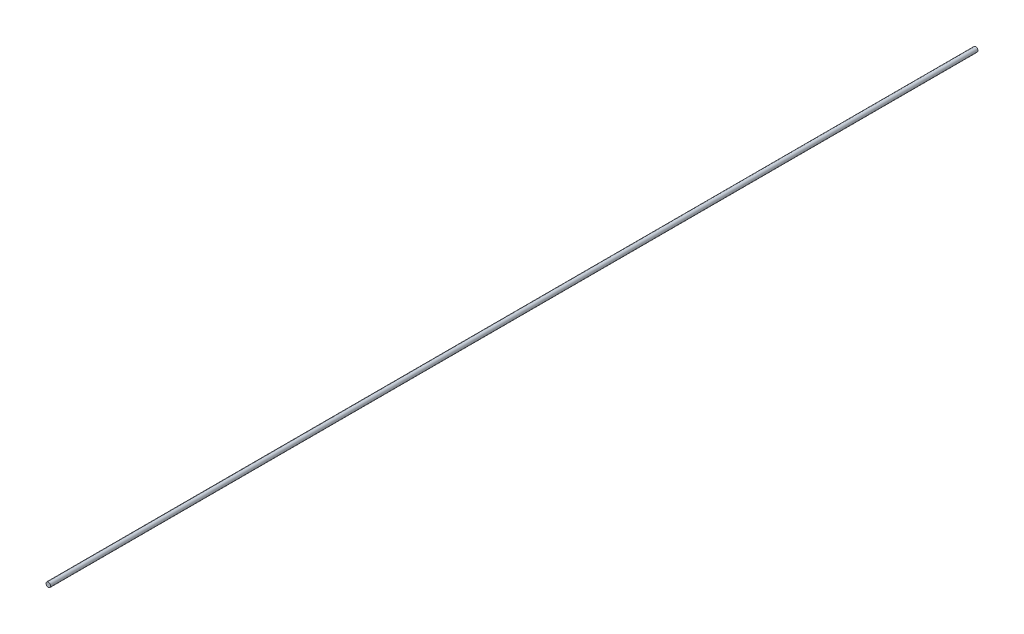
ISO-10303-21;
HEADER;
FILE_DESCRIPTION(('STEP AP214'),'2;1');
FILE_NAME('part.step','',(''),(''),'','','');
FILE_SCHEMA(('AUTOMOTIVE_DESIGN { 1 0 10303 214 1 1 1 1 }'));
ENDSEC;
DATA;
#1=APPLICATION_CONTEXT('core data for automotive mechanical design processes');
#2=APPLICATION_PROTOCOL_DEFINITION('international standard','automotive_design',2000,#1);
#3=PRODUCT_CONTEXT('',#1,'mechanical');
#4=PRODUCT('Part','Part','',(#3));
#5=PRODUCT_RELATED_PRODUCT_CATEGORY('part','',(#4));
#6=PRODUCT_DEFINITION_FORMATION('','',#4);
#7=PRODUCT_DEFINITION_CONTEXT('part definition',#1,'design');
#8=PRODUCT_DEFINITION('design','',#6,#7);
#9=PRODUCT_DEFINITION_SHAPE('','',#8);
#10=(LENGTH_UNIT() NAMED_UNIT(*) SI_UNIT(.MILLI.,.METRE.));
#11=(NAMED_UNIT(*) PLANE_ANGLE_UNIT() SI_UNIT($,.RADIAN.));
#12=(NAMED_UNIT(*) SI_UNIT($,.STERADIAN.) SOLID_ANGLE_UNIT());
#13=UNCERTAINTY_MEASURE_WITH_UNIT(LENGTH_MEASURE(1.E-05),#10,'distance_accuracy_value','');
#14=(GEOMETRIC_REPRESENTATION_CONTEXT(3) GLOBAL_UNCERTAINTY_ASSIGNED_CONTEXT((#13)) GLOBAL_UNIT_ASSIGNED_CONTEXT((#10,
#11,#12)) REPRESENTATION_CONTEXT('',''));
#15=CARTESIAN_POINT('',(0.,0.,0.));
#16=DIRECTION('',(0.,0.,1.));
#17=DIRECTION('',(1.,0.,0.));
#18=AXIS2_PLACEMENT_3D('',#15,#16,#17);
#19=CARTESIAN_POINT('',(0.,0.,200.));
#20=DIRECTION('',(0.,0.,-1.));
#21=DIRECTION('',(-1.,0.,0.));
#22=AXIS2_PLACEMENT_3D('',#19,#20,#21);
#23=CYLINDRICAL_SURFACE('',#22,0.5);
#24=CARTESIAN_POINT('',(0.,0.,200.));
#25=DIRECTION('',(0.,0.,1.));
#26=DIRECTION('',(1.,0.,0.));
#27=AXIS2_PLACEMENT_3D('',#24,#25,#26);
#28=CIRCLE('',#27,0.5);
#29=CARTESIAN_POINT('',(0.5,0.,200.));
#30=VERTEX_POINT('',#29);
#31=EDGE_CURVE('E10',#30,#30,#28,.T.);
#32=ORIENTED_EDGE('',*,*,#31,.F.);
#33=EDGE_LOOP('',(#32));
#34=FACE_BOUND('',#33,.T.);
#35=CARTESIAN_POINT('',(0.,0.,0.));
#36=DIRECTION('',(0.,0.,1.));
#37=DIRECTION('',(1.,0.,0.));
#38=AXIS2_PLACEMENT_3D('',#35,#36,#37);
#39=CIRCLE('',#38,0.5);
#40=CARTESIAN_POINT('',(0.5,0.,0.));
#41=VERTEX_POINT('',#40);
#42=EDGE_CURVE('E34',#41,#41,#39,.T.);
#43=ORIENTED_EDGE('',*,*,#42,.T.);
#44=EDGE_LOOP('',(#43));
#45=FACE_BOUND('',#44,.T.);
#46=ADVANCED_FACE('F31',(#34,#45),#23,.T.);
#47=CARTESIAN_POINT('',(0.,0.,200.));
#48=DIRECTION('',(0.,0.,1.));
#49=DIRECTION('',(1.,0.,0.));
#50=AXIS2_PLACEMENT_3D('',#47,#48,#49);
#51=PLANE('',#50);
#52=ORIENTED_EDGE('',*,*,#31,.T.);
#53=EDGE_LOOP('',(#52));
#54=FACE_BOUND('',#53,.T.);
#55=ADVANCED_FACE('F46',(#54),#51,.T.);
#56=CARTESIAN_POINT('',(0.,0.,0.));
#57=DIRECTION('',(0.,0.,1.));
#58=DIRECTION('',(1.,0.,0.));
#59=AXIS2_PLACEMENT_3D('',#56,#57,#58);
#60=PLANE('',#59);
#61=ORIENTED_EDGE('',*,*,#42,.F.);
#62=EDGE_LOOP('',(#61));
#63=FACE_BOUND('',#62,.T.);
#64=ADVANCED_FACE('F44',(#63),#60,.F.);
#65=CLOSED_SHELL('',(#46,#55,#64));
#66=MANIFOLD_SOLID_BREP('B2',#65);
#67=ADVANCED_BREP_SHAPE_REPRESENTATION('',(#18,#66),#14);
#68=SHAPE_DEFINITION_REPRESENTATION(#9,#67);
ENDSEC;
END-ISO-10303-21;
